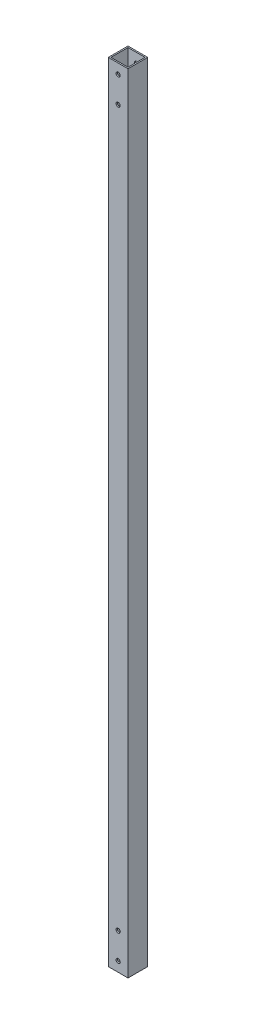
ISO-10303-21;
HEADER;
FILE_DESCRIPTION(('STEP AP214'),'2;1');
FILE_NAME('part.step','',(''),(''),'','','');
FILE_SCHEMA(('AUTOMOTIVE_DESIGN { 1 0 10303 214 1 1 1 1 }'));
ENDSEC;
DATA;
#1=APPLICATION_CONTEXT('core data for automotive mechanical design processes');
#2=APPLICATION_PROTOCOL_DEFINITION('international standard','automotive_design',2000,#1);
#3=PRODUCT_CONTEXT('',#1,'mechanical');
#4=PRODUCT('Part','Part','',(#3));
#5=PRODUCT_RELATED_PRODUCT_CATEGORY('part','',(#4));
#6=PRODUCT_DEFINITION_FORMATION('','',#4);
#7=PRODUCT_DEFINITION_CONTEXT('part definition',#1,'design');
#8=PRODUCT_DEFINITION('design','',#6,#7);
#9=PRODUCT_DEFINITION_SHAPE('','',#8);
#10=(LENGTH_UNIT() NAMED_UNIT(*) SI_UNIT(.MILLI.,.METRE.));
#11=(NAMED_UNIT(*) PLANE_ANGLE_UNIT() SI_UNIT($,.RADIAN.));
#12=(NAMED_UNIT(*) SI_UNIT($,.STERADIAN.) SOLID_ANGLE_UNIT());
#13=UNCERTAINTY_MEASURE_WITH_UNIT(LENGTH_MEASURE(1.E-05),#10,'distance_accuracy_value','');
#14=(GEOMETRIC_REPRESENTATION_CONTEXT(3) GLOBAL_UNCERTAINTY_ASSIGNED_CONTEXT((#13)) GLOBAL_UNIT_ASSIGNED_CONTEXT((#10,
#11,#12)) REPRESENTATION_CONTEXT('',''));
#15=CARTESIAN_POINT('',(0.,0.,0.));
#16=DIRECTION('',(0.,0.,1.));
#17=DIRECTION('',(1.,0.,0.));
#18=AXIS2_PLACEMENT_3D('',#15,#16,#17);
#19=CARTESIAN_POINT('',(0.,600.,0.));
#20=DIRECTION('',(0.,1.,0.));
#21=DIRECTION('',(0.,0.,1.));
#22=AXIS2_PLACEMENT_3D('',#19,#20,#21);
#23=PLANE('',#22);
#24=DIRECTION('',(0.,0.,-1.));
#25=VECTOR('',#24,1.);
#26=CARTESIAN_POINT('',(7.5,600.,7.5));
#27=LINE('',#26,#25);
#28=CARTESIAN_POINT('',(7.5,600.,7.5));
#29=VERTEX_POINT('',#28);
#30=CARTESIAN_POINT('',(7.5,600.,-7.5));
#31=VERTEX_POINT('',#30);
#32=EDGE_CURVE('E187',#29,#31,#27,.T.);
#33=ORIENTED_EDGE('',*,*,#32,.T.);
#34=DIRECTION('',(-1.,0.,0.));
#35=VECTOR('',#34,1.);
#36=CARTESIAN_POINT('',(-7.5,600.,-7.5));
#37=LINE('',#36,#35);
#38=CARTESIAN_POINT('',(-7.5,600.,-7.5));
#39=VERTEX_POINT('',#38);
#40=EDGE_CURVE('E191',#31,#39,#37,.T.);
#41=ORIENTED_EDGE('',*,*,#40,.T.);
#42=DIRECTION('',(0.,0.,1.));
#43=VECTOR('',#42,1.);
#44=CARTESIAN_POINT('',(-7.5,600.,7.5));
#45=LINE('',#44,#43);
#46=CARTESIAN_POINT('',(-7.5,600.,7.5));
#47=VERTEX_POINT('',#46);
#48=EDGE_CURVE('E195',#39,#47,#45,.T.);
#49=ORIENTED_EDGE('',*,*,#48,.T.);
#50=DIRECTION('',(1.,0.,0.));
#51=VECTOR('',#50,1.);
#52=CARTESIAN_POINT('',(-7.5,600.,7.5));
#53=LINE('',#52,#51);
#54=EDGE_CURVE('E198',#47,#29,#53,.T.);
#55=ORIENTED_EDGE('',*,*,#54,.T.);
#56=EDGE_LOOP('',(#33,#41,#49,#55));
#57=FACE_BOUND('',#56,.T.);
#58=DIRECTION('',(-1.,0.,0.));
#59=VECTOR('',#58,1.);
#60=CARTESIAN_POINT('',(0.,600.,-6.5));
#61=LINE('',#60,#59);
#62=CARTESIAN_POINT('',(6.5,600.,-6.5));
#63=VERTEX_POINT('',#62);
#64=CARTESIAN_POINT('',(-6.5,600.,-6.5));
#65=VERTEX_POINT('',#64);
#66=EDGE_CURVE('E146',#63,#65,#61,.T.);
#67=ORIENTED_EDGE('',*,*,#66,.F.);
#68=DIRECTION('',(0.,0.,-1.));
#69=VECTOR('',#68,1.);
#70=CARTESIAN_POINT('',(6.5,600.,0.));
#71=LINE('',#70,#69);
#72=CARTESIAN_POINT('',(6.5,600.,6.5));
#73=VERTEX_POINT('',#72);
#74=EDGE_CURVE('E137',#73,#63,#71,.T.);
#75=ORIENTED_EDGE('',*,*,#74,.F.);
#76=DIRECTION('',(1.,0.,0.));
#77=VECTOR('',#76,1.);
#78=CARTESIAN_POINT('',(0.,600.,6.5));
#79=LINE('',#78,#77);
#80=CARTESIAN_POINT('',(-6.5,600.,6.5));
#81=VERTEX_POINT('',#80);
#82=EDGE_CURVE('E163',#81,#73,#79,.T.);
#83=ORIENTED_EDGE('',*,*,#82,.F.);
#84=DIRECTION('',(0.,0.,1.));
#85=VECTOR('',#84,1.);
#86=CARTESIAN_POINT('',(-6.5,600.,0.));
#87=LINE('',#86,#85);
#88=EDGE_CURVE('E159',#65,#81,#87,.T.);
#89=ORIENTED_EDGE('',*,*,#88,.F.);
#90=EDGE_LOOP('',(#67,#75,#83,#89));
#91=FACE_BOUND('',#90,.T.);
#92=ADVANCED_FACE('F69',(#57,#91),#23,.T.);
#93=CARTESIAN_POINT('',(0.,0.,0.));
#94=DIRECTION('',(0.,1.,0.));
#95=DIRECTION('',(0.,0.,1.));
#96=AXIS2_PLACEMENT_3D('',#93,#94,#95);
#97=PLANE('',#96);
#98=DIRECTION('',(0.,0.,-1.));
#99=VECTOR('',#98,1.);
#100=CARTESIAN_POINT('',(7.5,0.,7.5));
#101=LINE('',#100,#99);
#102=CARTESIAN_POINT('',(7.5,0.,7.5));
#103=VERTEX_POINT('',#102);
#104=CARTESIAN_POINT('',(7.5,0.,-7.5));
#105=VERTEX_POINT('',#104);
#106=EDGE_CURVE('E155',#103,#105,#101,.T.);
#107=ORIENTED_EDGE('',*,*,#106,.F.);
#108=DIRECTION('',(1.,0.,0.));
#109=VECTOR('',#108,1.);
#110=CARTESIAN_POINT('',(-7.5,0.,7.5));
#111=LINE('',#110,#109);
#112=CARTESIAN_POINT('',(-7.5,0.,7.5));
#113=VERTEX_POINT('',#112);
#114=EDGE_CURVE('E192',#113,#103,#111,.T.);
#115=ORIENTED_EDGE('',*,*,#114,.F.);
#116=DIRECTION('',(0.,0.,1.));
#117=VECTOR('',#116,1.);
#118=CARTESIAN_POINT('',(-7.5,0.,7.5));
#119=LINE('',#118,#117);
#120=CARTESIAN_POINT('',(-7.5,0.,-7.5));
#121=VERTEX_POINT('',#120);
#122=EDGE_CURVE('E208',#121,#113,#119,.T.);
#123=ORIENTED_EDGE('',*,*,#122,.F.);
#124=DIRECTION('',(-1.,0.,0.));
#125=VECTOR('',#124,1.);
#126=CARTESIAN_POINT('',(-7.5,0.,-7.5));
#127=LINE('',#126,#125);
#128=EDGE_CURVE('E205',#105,#121,#127,.T.);
#129=ORIENTED_EDGE('',*,*,#128,.F.);
#130=EDGE_LOOP('',(#107,#115,#123,#129));
#131=FACE_BOUND('',#130,.T.);
#132=DIRECTION('',(0.,0.,-1.));
#133=VECTOR('',#132,1.);
#134=CARTESIAN_POINT('',(6.5,0.,0.));
#135=LINE('',#134,#133);
#136=CARTESIAN_POINT('',(6.5,0.,6.5));
#137=VERTEX_POINT('',#136);
#138=CARTESIAN_POINT('',(6.5,0.,-6.5));
#139=VERTEX_POINT('',#138);
#140=EDGE_CURVE('E95',#137,#139,#135,.T.);
#141=ORIENTED_EDGE('',*,*,#140,.T.);
#142=DIRECTION('',(-1.,0.,0.));
#143=VECTOR('',#142,1.);
#144=CARTESIAN_POINT('',(0.,0.,-6.5));
#145=LINE('',#144,#143);
#146=CARTESIAN_POINT('',(-6.5,0.,-6.5));
#147=VERTEX_POINT('',#146);
#148=EDGE_CURVE('E153',#139,#147,#145,.T.);
#149=ORIENTED_EDGE('',*,*,#148,.T.);
#150=DIRECTION('',(0.,0.,1.));
#151=VECTOR('',#150,1.);
#152=CARTESIAN_POINT('',(-6.5,0.,0.));
#153=LINE('',#152,#151);
#154=CARTESIAN_POINT('',(-6.5,0.,6.5));
#155=VERTEX_POINT('',#154);
#156=EDGE_CURVE('E174',#147,#155,#153,.T.);
#157=ORIENTED_EDGE('',*,*,#156,.T.);
#158=DIRECTION('',(1.,0.,0.));
#159=VECTOR('',#158,1.);
#160=CARTESIAN_POINT('',(0.,0.,6.5));
#161=LINE('',#160,#159);
#162=EDGE_CURVE('E147',#155,#137,#161,.T.);
#163=ORIENTED_EDGE('',*,*,#162,.T.);
#164=EDGE_LOOP('',(#141,#149,#157,#163));
#165=FACE_BOUND('',#164,.T.);
#166=ADVANCED_FACE('F272',(#131,#165),#97,.F.);
#167=CARTESIAN_POINT('',(7.5,600.,7.5));
#168=DIRECTION('',(-1.,0.,0.));
#169=DIRECTION('',(0.,0.,1.));
#170=AXIS2_PLACEMENT_3D('',#167,#168,#169);
#171=PLANE('',#170);
#172=ORIENTED_EDGE('',*,*,#106,.T.);
#173=DIRECTION('',(0.,-1.,0.));
#174=VECTOR('',#173,1.);
#175=CARTESIAN_POINT('',(7.5,600.,-7.5));
#176=LINE('',#175,#174);
#177=EDGE_CURVE('E12',#31,#105,#176,.T.);
#178=ORIENTED_EDGE('',*,*,#177,.F.);
#179=ORIENTED_EDGE('',*,*,#32,.F.);
#180=DIRECTION('',(0.,-1.,0.));
#181=VECTOR('',#180,1.);
#182=CARTESIAN_POINT('',(7.5,600.,7.5));
#183=LINE('',#182,#181);
#184=EDGE_CURVE('E201',#29,#103,#183,.T.);
#185=ORIENTED_EDGE('',*,*,#184,.T.);
#186=EDGE_LOOP('',(#172,#178,#179,#185));
#187=FACE_BOUND('',#186,.T.);
#188=ADVANCED_FACE('F71',(#187),#171,.F.);
#189=CARTESIAN_POINT('',(-7.5,600.,-7.5));
#190=DIRECTION('',(0.,0.,1.));
#191=DIRECTION('',(1.,0.,0.));
#192=AXIS2_PLACEMENT_3D('',#189,#190,#191);
#193=PLANE('',#192);
#194=CARTESIAN_POINT('',(0.,7.5,-7.5));
#195=DIRECTION('',(0.,0.,1.));
#196=DIRECTION('',(1.,0.,0.));
#197=AXIS2_PLACEMENT_3D('',#194,#195,#196);
#198=CIRCLE('',#197,1.6);
#199=CARTESIAN_POINT('',(1.6,7.5,-7.5));
#200=VERTEX_POINT('',#199);
#201=EDGE_CURVE('E228',#200,#200,#198,.T.);
#202=ORIENTED_EDGE('',*,*,#201,.T.);
#203=EDGE_LOOP('',(#202));
#204=FACE_BOUND('',#203,.T.);
#205=CARTESIAN_POINT('',(0.,572.5,-7.5));
#206=DIRECTION('',(0.,0.,1.));
#207=DIRECTION('',(1.,0.,0.));
#208=AXIS2_PLACEMENT_3D('',#205,#206,#207);
#209=CIRCLE('',#208,1.60000000000005);
#210=CARTESIAN_POINT('',(1.60000000000005,572.5,-7.5));
#211=VERTEX_POINT('',#210);
#212=EDGE_CURVE('E312',#211,#211,#209,.T.);
#213=ORIENTED_EDGE('',*,*,#212,.T.);
#214=EDGE_LOOP('',(#213));
#215=FACE_BOUND('',#214,.T.);
#216=CARTESIAN_POINT('',(0.,592.5,-7.5));
#217=DIRECTION('',(0.,0.,1.));
#218=DIRECTION('',(1.,0.,0.));
#219=AXIS2_PLACEMENT_3D('',#216,#217,#218);
#220=CIRCLE('',#219,1.60000000000005);
#221=CARTESIAN_POINT('',(1.60000000000005,592.5,-7.5));
#222=VERTEX_POINT('',#221);
#223=EDGE_CURVE('E316',#222,#222,#220,.T.);
#224=ORIENTED_EDGE('',*,*,#223,.T.);
#225=EDGE_LOOP('',(#224));
#226=FACE_BOUND('',#225,.T.);
#227=CARTESIAN_POINT('',(0.,27.5,-7.5));
#228=DIRECTION('',(0.,0.,1.));
#229=DIRECTION('',(1.,0.,0.));
#230=AXIS2_PLACEMENT_3D('',#227,#228,#229);
#231=CIRCLE('',#230,1.6);
#232=CARTESIAN_POINT('',(1.6,27.5,-7.5));
#233=VERTEX_POINT('',#232);
#234=EDGE_CURVE('E320',#233,#233,#231,.T.);
#235=ORIENTED_EDGE('',*,*,#234,.T.);
#236=EDGE_LOOP('',(#235));
#237=FACE_BOUND('',#236,.T.);
#238=ORIENTED_EDGE('',*,*,#128,.T.);
#239=DIRECTION('',(0.,-1.,0.));
#240=VECTOR('',#239,1.);
#241=CARTESIAN_POINT('',(-7.5,600.,-7.5));
#242=LINE('',#241,#240);
#243=EDGE_CURVE('E79',#39,#121,#242,.T.);
#244=ORIENTED_EDGE('',*,*,#243,.F.);
#245=ORIENTED_EDGE('',*,*,#40,.F.);
#246=ORIENTED_EDGE('',*,*,#177,.T.);
#247=EDGE_LOOP('',(#238,#244,#245,#246));
#248=FACE_BOUND('',#247,.T.);
#249=ADVANCED_FACE('F299',(#204,#215,#226,#237,#248),#193,.F.);
#250=CARTESIAN_POINT('',(-7.5,600.,7.5));
#251=DIRECTION('',(1.,0.,0.));
#252=DIRECTION('',(0.,0.,-1.));
#253=AXIS2_PLACEMENT_3D('',#250,#251,#252);
#254=PLANE('',#253);
#255=ORIENTED_EDGE('',*,*,#122,.T.);
#256=DIRECTION('',(0.,-1.,0.));
#257=VECTOR('',#256,1.);
#258=CARTESIAN_POINT('',(-7.5,600.,7.5));
#259=LINE('',#258,#257);
#260=EDGE_CURVE('E216',#47,#113,#259,.T.);
#261=ORIENTED_EDGE('',*,*,#260,.F.);
#262=ORIENTED_EDGE('',*,*,#48,.F.);
#263=ORIENTED_EDGE('',*,*,#243,.T.);
#264=EDGE_LOOP('',(#255,#261,#262,#263));
#265=FACE_BOUND('',#264,.T.);
#266=ADVANCED_FACE('F296',(#265),#254,.F.);
#267=CARTESIAN_POINT('',(-7.5,600.,7.5));
#268=DIRECTION('',(0.,0.,-1.));
#269=DIRECTION('',(-1.,0.,0.));
#270=AXIS2_PLACEMENT_3D('',#267,#268,#269);
#271=PLANE('',#270);
#272=CARTESIAN_POINT('',(0.,7.5,7.5));
#273=DIRECTION('',(0.,0.,1.));
#274=DIRECTION('',(1.,0.,0.));
#275=AXIS2_PLACEMENT_3D('',#272,#273,#274);
#276=CIRCLE('',#275,1.6);
#277=CARTESIAN_POINT('',(1.6,7.5,7.5));
#278=VERTEX_POINT('',#277);
#279=EDGE_CURVE('E340',#278,#278,#276,.T.);
#280=ORIENTED_EDGE('',*,*,#279,.F.);
#281=EDGE_LOOP('',(#280));
#282=FACE_BOUND('',#281,.T.);
#283=CARTESIAN_POINT('',(0.,572.5,7.5));
#284=DIRECTION('',(0.,0.,1.));
#285=DIRECTION('',(1.,0.,0.));
#286=AXIS2_PLACEMENT_3D('',#283,#284,#285);
#287=CIRCLE('',#286,1.60000000000005);
#288=CARTESIAN_POINT('',(1.60000000000005,572.5,7.5));
#289=VERTEX_POINT('',#288);
#290=EDGE_CURVE('E346',#289,#289,#287,.T.);
#291=ORIENTED_EDGE('',*,*,#290,.F.);
#292=EDGE_LOOP('',(#291));
#293=FACE_BOUND('',#292,.T.);
#294=CARTESIAN_POINT('',(0.,592.5,7.5));
#295=DIRECTION('',(0.,0.,1.));
#296=DIRECTION('',(1.,0.,0.));
#297=AXIS2_PLACEMENT_3D('',#294,#295,#296);
#298=CIRCLE('',#297,1.60000000000005);
#299=CARTESIAN_POINT('',(1.60000000000005,592.5,7.5));
#300=VERTEX_POINT('',#299);
#301=EDGE_CURVE('E335',#300,#300,#298,.T.);
#302=ORIENTED_EDGE('',*,*,#301,.F.);
#303=EDGE_LOOP('',(#302));
#304=FACE_BOUND('',#303,.T.);
#305=CARTESIAN_POINT('',(0.,27.5,7.5));
#306=DIRECTION('',(0.,0.,1.));
#307=DIRECTION('',(1.,0.,0.));
#308=AXIS2_PLACEMENT_3D('',#305,#306,#307);
#309=CIRCLE('',#308,1.6);
#310=CARTESIAN_POINT('',(1.6,27.5,7.5));
#311=VERTEX_POINT('',#310);
#312=EDGE_CURVE('E334',#311,#311,#309,.T.);
#313=ORIENTED_EDGE('',*,*,#312,.F.);
#314=EDGE_LOOP('',(#313));
#315=FACE_BOUND('',#314,.T.);
#316=ORIENTED_EDGE('',*,*,#114,.T.);
#317=ORIENTED_EDGE('',*,*,#184,.F.);
#318=ORIENTED_EDGE('',*,*,#54,.F.);
#319=ORIENTED_EDGE('',*,*,#260,.T.);
#320=EDGE_LOOP('',(#316,#317,#318,#319));
#321=FACE_BOUND('',#320,.T.);
#322=ADVANCED_FACE('F293',(#282,#293,#304,#315,#321),#271,.F.);
#323=CARTESIAN_POINT('',(6.5,600.,0.));
#324=DIRECTION('',(-1.,0.,0.));
#325=DIRECTION('',(0.,0.,1.));
#326=AXIS2_PLACEMENT_3D('',#323,#324,#325);
#327=PLANE('',#326);
#328=ORIENTED_EDGE('',*,*,#140,.F.);
#329=DIRECTION('',(0.,-1.,0.));
#330=VECTOR('',#329,1.);
#331=CARTESIAN_POINT('',(6.5,600.,6.5));
#332=LINE('',#331,#330);
#333=EDGE_CURVE('E141',#73,#137,#332,.T.);
#334=ORIENTED_EDGE('',*,*,#333,.F.);
#335=ORIENTED_EDGE('',*,*,#74,.T.);
#336=DIRECTION('',(0.,-1.,0.));
#337=VECTOR('',#336,1.);
#338=CARTESIAN_POINT('',(6.5,600.,-6.5));
#339=LINE('',#338,#337);
#340=EDGE_CURVE('E140',#63,#139,#339,.T.);
#341=ORIENTED_EDGE('',*,*,#340,.T.);
#342=EDGE_LOOP('',(#328,#334,#335,#341));
#343=FACE_BOUND('',#342,.T.);
#344=ADVANCED_FACE('F139',(#343),#327,.T.);
#345=CARTESIAN_POINT('',(0.,600.,-6.5));
#346=DIRECTION('',(0.,0.,1.));
#347=DIRECTION('',(1.,0.,0.));
#348=AXIS2_PLACEMENT_3D('',#345,#346,#347);
#349=PLANE('',#348);
#350=CARTESIAN_POINT('',(0.,7.5,-6.5));
#351=DIRECTION('',(0.,0.,1.));
#352=DIRECTION('',(1.,0.,0.));
#353=AXIS2_PLACEMENT_3D('',#350,#351,#352);
#354=CIRCLE('',#353,1.6);
#355=CARTESIAN_POINT('',(1.6,7.5,-6.5));
#356=VERTEX_POINT('',#355);
#357=EDGE_CURVE('E171',#356,#356,#354,.T.);
#358=ORIENTED_EDGE('',*,*,#357,.F.);
#359=EDGE_LOOP('',(#358));
#360=FACE_BOUND('',#359,.T.);
#361=CARTESIAN_POINT('',(0.,572.5,-6.5));
#362=DIRECTION('',(0.,0.,1.));
#363=DIRECTION('',(1.,0.,0.));
#364=AXIS2_PLACEMENT_3D('',#361,#362,#363);
#365=CIRCLE('',#364,1.60000000000005);
#366=CARTESIAN_POINT('',(1.60000000000005,572.5,-6.5));
#367=VERTEX_POINT('',#366);
#368=EDGE_CURVE('E236',#367,#367,#365,.T.);
#369=ORIENTED_EDGE('',*,*,#368,.F.);
#370=EDGE_LOOP('',(#369));
#371=FACE_BOUND('',#370,.T.);
#372=CARTESIAN_POINT('',(0.,592.5,-6.5));
#373=DIRECTION('',(0.,0.,1.));
#374=DIRECTION('',(1.,0.,0.));
#375=AXIS2_PLACEMENT_3D('',#372,#373,#374);
#376=CIRCLE('',#375,1.60000000000005);
#377=CARTESIAN_POINT('',(1.60000000000005,592.5,-6.5));
#378=VERTEX_POINT('',#377);
#379=EDGE_CURVE('E232',#378,#378,#376,.T.);
#380=ORIENTED_EDGE('',*,*,#379,.F.);
#381=EDGE_LOOP('',(#380));
#382=FACE_BOUND('',#381,.T.);
#383=CARTESIAN_POINT('',(0.,27.5,-6.5));
#384=DIRECTION('',(0.,0.,1.));
#385=DIRECTION('',(1.,0.,0.));
#386=AXIS2_PLACEMENT_3D('',#383,#384,#385);
#387=CIRCLE('',#386,1.6);
#388=CARTESIAN_POINT('',(1.6,27.5,-6.5));
#389=VERTEX_POINT('',#388);
#390=EDGE_CURVE('E227',#389,#389,#387,.T.);
#391=ORIENTED_EDGE('',*,*,#390,.F.);
#392=EDGE_LOOP('',(#391));
#393=FACE_BOUND('',#392,.T.);
#394=ORIENTED_EDGE('',*,*,#148,.F.);
#395=ORIENTED_EDGE('',*,*,#340,.F.);
#396=ORIENTED_EDGE('',*,*,#66,.T.);
#397=DIRECTION('',(0.,-1.,0.));
#398=VECTOR('',#397,1.);
#399=CARTESIAN_POINT('',(-6.5,600.,-6.5));
#400=LINE('',#399,#398);
#401=EDGE_CURVE('E156',#65,#147,#400,.T.);
#402=ORIENTED_EDGE('',*,*,#401,.T.);
#403=EDGE_LOOP('',(#394,#395,#396,#402));
#404=FACE_BOUND('',#403,.T.);
#405=ADVANCED_FACE('F150',(#360,#371,#382,#393,#404),#349,.T.);
#406=CARTESIAN_POINT('',(-6.5,600.,0.));
#407=DIRECTION('',(1.,0.,0.));
#408=DIRECTION('',(0.,0.,-1.));
#409=AXIS2_PLACEMENT_3D('',#406,#407,#408);
#410=PLANE('',#409);
#411=ORIENTED_EDGE('',*,*,#156,.F.);
#412=ORIENTED_EDGE('',*,*,#401,.F.);
#413=ORIENTED_EDGE('',*,*,#88,.T.);
#414=DIRECTION('',(0.,-1.,0.));
#415=VECTOR('',#414,1.);
#416=CARTESIAN_POINT('',(-6.5,600.,6.5));
#417=LINE('',#416,#415);
#418=EDGE_CURVE('E87',#81,#155,#417,.T.);
#419=ORIENTED_EDGE('',*,*,#418,.T.);
#420=EDGE_LOOP('',(#411,#412,#413,#419));
#421=FACE_BOUND('',#420,.T.);
#422=ADVANCED_FACE('F264',(#421),#410,.T.);
#423=CARTESIAN_POINT('',(0.,600.,6.5));
#424=DIRECTION('',(0.,0.,-1.));
#425=DIRECTION('',(-1.,0.,0.));
#426=AXIS2_PLACEMENT_3D('',#423,#424,#425);
#427=PLANE('',#426);
#428=CARTESIAN_POINT('',(0.,7.5,6.5));
#429=DIRECTION('',(0.,0.,-1.));
#430=DIRECTION('',(-1.,0.,0.));
#431=AXIS2_PLACEMENT_3D('',#428,#429,#430);
#432=CIRCLE('',#431,1.6);
#433=CARTESIAN_POINT('',(-1.6,7.5,6.5));
#434=VERTEX_POINT('',#433);
#435=EDGE_CURVE('E73',#434,#434,#432,.T.);
#436=ORIENTED_EDGE('',*,*,#435,.F.);
#437=EDGE_LOOP('',(#436));
#438=FACE_BOUND('',#437,.T.);
#439=CARTESIAN_POINT('',(0.,572.5,6.5));
#440=DIRECTION('',(0.,0.,-1.));
#441=DIRECTION('',(-1.,0.,0.));
#442=AXIS2_PLACEMENT_3D('',#439,#440,#441);
#443=CIRCLE('',#442,1.60000000000005);
#444=CARTESIAN_POINT('',(-1.60000000000005,572.5,6.5));
#445=VERTEX_POINT('',#444);
#446=EDGE_CURVE('E233',#445,#445,#443,.T.);
#447=ORIENTED_EDGE('',*,*,#446,.F.);
#448=EDGE_LOOP('',(#447));
#449=FACE_BOUND('',#448,.T.);
#450=CARTESIAN_POINT('',(0.,592.5,6.5));
#451=DIRECTION('',(0.,0.,-1.));
#452=DIRECTION('',(-1.,0.,0.));
#453=AXIS2_PLACEMENT_3D('',#450,#451,#452);
#454=CIRCLE('',#453,1.60000000000005);
#455=CARTESIAN_POINT('',(-1.60000000000005,592.5,6.5));
#456=VERTEX_POINT('',#455);
#457=EDGE_CURVE('E229',#456,#456,#454,.T.);
#458=ORIENTED_EDGE('',*,*,#457,.F.);
#459=EDGE_LOOP('',(#458));
#460=FACE_BOUND('',#459,.T.);
#461=CARTESIAN_POINT('',(0.,27.5,6.5));
#462=DIRECTION('',(0.,0.,-1.));
#463=DIRECTION('',(-1.,0.,0.));
#464=AXIS2_PLACEMENT_3D('',#461,#462,#463);
#465=CIRCLE('',#464,1.6);
#466=CARTESIAN_POINT('',(-1.6,27.5,6.5));
#467=VERTEX_POINT('',#466);
#468=EDGE_CURVE('E223',#467,#467,#465,.T.);
#469=ORIENTED_EDGE('',*,*,#468,.F.);
#470=EDGE_LOOP('',(#469));
#471=FACE_BOUND('',#470,.T.);
#472=ORIENTED_EDGE('',*,*,#162,.F.);
#473=ORIENTED_EDGE('',*,*,#418,.F.);
#474=ORIENTED_EDGE('',*,*,#82,.T.);
#475=ORIENTED_EDGE('',*,*,#333,.T.);
#476=EDGE_LOOP('',(#472,#473,#474,#475));
#477=FACE_BOUND('',#476,.T.);
#478=ADVANCED_FACE('F260',(#438,#449,#460,#471,#477),#427,.T.);
#479=CARTESIAN_POINT('',(0.,27.5,-7.5));
#480=DIRECTION('',(0.,0.,1.));
#481=DIRECTION('',(1.,0.,0.));
#482=AXIS2_PLACEMENT_3D('',#479,#480,#481);
#483=CYLINDRICAL_SURFACE('',#482,1.6);
#484=ORIENTED_EDGE('',*,*,#468,.T.);
#485=EDGE_LOOP('',(#484));
#486=FACE_BOUND('',#485,.T.);
#487=ORIENTED_EDGE('',*,*,#312,.T.);
#488=EDGE_LOOP('',(#487));
#489=FACE_BOUND('',#488,.T.);
#490=ADVANCED_FACE('F263',(#486,#489),#483,.F.);
#491=CARTESIAN_POINT('',(0.,592.5,-7.5));
#492=DIRECTION('',(0.,0.,1.));
#493=DIRECTION('',(1.,0.,0.));
#494=AXIS2_PLACEMENT_3D('',#491,#492,#493);
#495=CYLINDRICAL_SURFACE('',#494,1.60000000000005);
#496=ORIENTED_EDGE('',*,*,#457,.T.);
#497=EDGE_LOOP('',(#496));
#498=FACE_BOUND('',#497,.T.);
#499=ORIENTED_EDGE('',*,*,#301,.T.);
#500=EDGE_LOOP('',(#499));
#501=FACE_BOUND('',#500,.T.);
#502=ADVANCED_FACE('F373',(#498,#501),#495,.F.);
#503=CARTESIAN_POINT('',(0.,572.5,-7.5));
#504=DIRECTION('',(0.,0.,1.));
#505=DIRECTION('',(1.,0.,0.));
#506=AXIS2_PLACEMENT_3D('',#503,#504,#505);
#507=CYLINDRICAL_SURFACE('',#506,1.60000000000005);
#508=ORIENTED_EDGE('',*,*,#446,.T.);
#509=EDGE_LOOP('',(#508));
#510=FACE_BOUND('',#509,.T.);
#511=ORIENTED_EDGE('',*,*,#290,.T.);
#512=EDGE_LOOP('',(#511));
#513=FACE_BOUND('',#512,.T.);
#514=ADVANCED_FACE('F374',(#510,#513),#507,.F.);
#515=CARTESIAN_POINT('',(0.,7.5,-7.5));
#516=DIRECTION('',(0.,0.,1.));
#517=DIRECTION('',(1.,0.,0.));
#518=AXIS2_PLACEMENT_3D('',#515,#516,#517);
#519=CYLINDRICAL_SURFACE('',#518,1.6);
#520=ORIENTED_EDGE('',*,*,#435,.T.);
#521=EDGE_LOOP('',(#520));
#522=FACE_BOUND('',#521,.T.);
#523=ORIENTED_EDGE('',*,*,#279,.T.);
#524=EDGE_LOOP('',(#523));
#525=FACE_BOUND('',#524,.T.);
#526=ADVANCED_FACE('F257',(#522,#525),#519,.F.);
#527=ORIENTED_EDGE('',*,*,#390,.T.);
#528=EDGE_LOOP('',(#527));
#529=FACE_BOUND('',#528,.T.);
#530=ORIENTED_EDGE('',*,*,#234,.F.);
#531=EDGE_LOOP('',(#530));
#532=FACE_BOUND('',#531,.T.);
#533=ADVANCED_FACE('F362',(#529,#532),#483,.F.);
#534=ORIENTED_EDGE('',*,*,#379,.T.);
#535=EDGE_LOOP('',(#534));
#536=FACE_BOUND('',#535,.T.);
#537=ORIENTED_EDGE('',*,*,#223,.F.);
#538=EDGE_LOOP('',(#537));
#539=FACE_BOUND('',#538,.T.);
#540=ADVANCED_FACE('F365',(#536,#539),#495,.F.);
#541=ORIENTED_EDGE('',*,*,#368,.T.);
#542=EDGE_LOOP('',(#541));
#543=FACE_BOUND('',#542,.T.);
#544=ORIENTED_EDGE('',*,*,#212,.F.);
#545=EDGE_LOOP('',(#544));
#546=FACE_BOUND('',#545,.T.);
#547=ADVANCED_FACE('F371',(#543,#546),#507,.F.);
#548=ORIENTED_EDGE('',*,*,#357,.T.);
#549=EDGE_LOOP('',(#548));
#550=FACE_BOUND('',#549,.T.);
#551=ORIENTED_EDGE('',*,*,#201,.F.);
#552=EDGE_LOOP('',(#551));
#553=FACE_BOUND('',#552,.T.);
#554=ADVANCED_FACE('F376',(#550,#553),#519,.F.);
#555=CLOSED_SHELL('',(#92,#166,#188,#249,#266,#322,#344,#405,#422,#478,#490,#502,#514,#526,#533,
#540,#547,#554));
#556=MANIFOLD_SOLID_BREP('B2',#555);
#557=ADVANCED_BREP_SHAPE_REPRESENTATION('',(#18,#556),#14);
#558=SHAPE_DEFINITION_REPRESENTATION(#9,#557);
ENDSEC;
END-ISO-10303-21;
